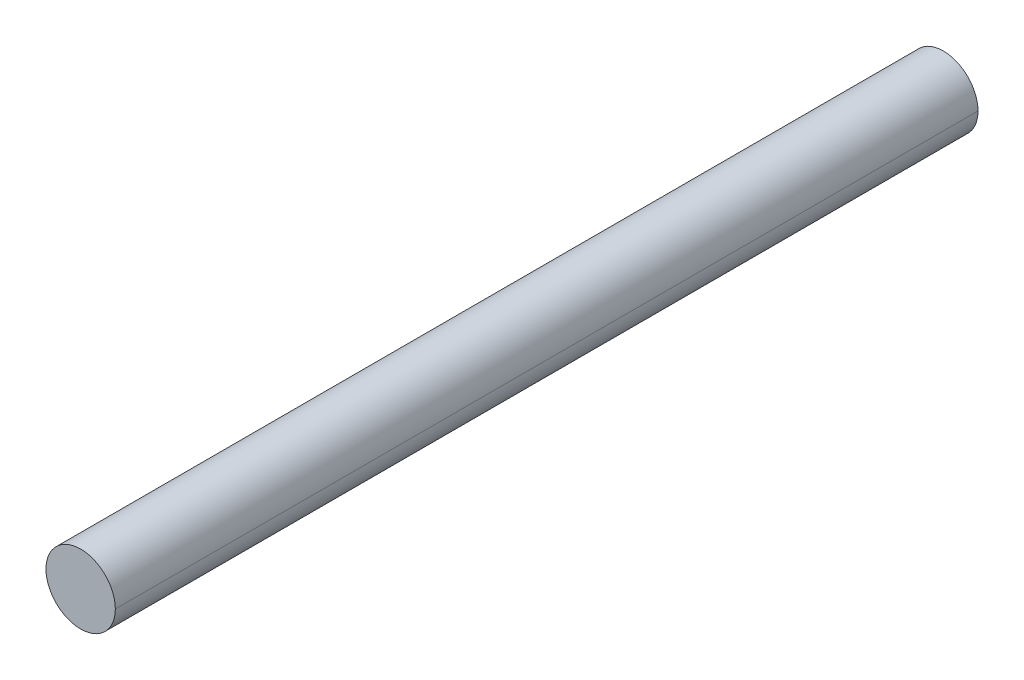
ISO-10303-21;
HEADER;
FILE_DESCRIPTION(('STEP AP214'),'2;1');
FILE_NAME('part.step','',(''),(''),'','','');
FILE_SCHEMA(('AUTOMOTIVE_DESIGN { 1 0 10303 214 1 1 1 1 }'));
ENDSEC;
DATA;
#1=APPLICATION_CONTEXT('core data for automotive mechanical design processes');
#2=APPLICATION_PROTOCOL_DEFINITION('international standard','automotive_design',2000,#1);
#3=PRODUCT_CONTEXT('',#1,'mechanical');
#4=PRODUCT('Part','Part','',(#3));
#5=PRODUCT_RELATED_PRODUCT_CATEGORY('part','',(#4));
#6=PRODUCT_DEFINITION_FORMATION('','',#4);
#7=PRODUCT_DEFINITION_CONTEXT('part definition',#1,'design');
#8=PRODUCT_DEFINITION('design','',#6,#7);
#9=PRODUCT_DEFINITION_SHAPE('','',#8);
#10=(LENGTH_UNIT() NAMED_UNIT(*) SI_UNIT(.MILLI.,.METRE.));
#11=(NAMED_UNIT(*) PLANE_ANGLE_UNIT() SI_UNIT($,.RADIAN.));
#12=(NAMED_UNIT(*) SI_UNIT($,.STERADIAN.) SOLID_ANGLE_UNIT());
#13=UNCERTAINTY_MEASURE_WITH_UNIT(LENGTH_MEASURE(1.E-05),#10,'distance_accuracy_value','');
#14=(GEOMETRIC_REPRESENTATION_CONTEXT(3) GLOBAL_UNCERTAINTY_ASSIGNED_CONTEXT((#13)) GLOBAL_UNIT_ASSIGNED_CONTEXT((#10,
#11,#12)) REPRESENTATION_CONTEXT('',''));
#15=CARTESIAN_POINT('',(0.,0.,0.));
#16=DIRECTION('',(0.,0.,1.));
#17=DIRECTION('',(1.,0.,0.));
#18=AXIS2_PLACEMENT_3D('',#15,#16,#17);
#19=CARTESIAN_POINT('',(24.3,5.71,-35.66));
#20=DIRECTION('',(0.,0.,-1.));
#21=DIRECTION('',(0.,-1.,0.));
#22=AXIS2_PLACEMENT_3D('',#19,#20,#21);
#23=PLANE('',#22);
#24=CARTESIAN_POINT('',(24.3,5.71,-35.66));
#25=DIRECTION('',(0.,0.,-1.));
#26=DIRECTION('',(1.,0.,0.));
#27=AXIS2_PLACEMENT_3D('',#24,#25,#26);
#28=CIRCLE('',#27,0.955);
#29=CARTESIAN_POINT('',(25.255,5.71,-35.66));
#30=VERTEX_POINT('',#29);
#31=CARTESIAN_POINT('',(23.345,5.71,-35.66));
#32=VERTEX_POINT('',#31);
#33=EDGE_CURVE('E61',#30,#32,#28,.T.);
#34=ORIENTED_EDGE('',*,*,#33,.T.);
#35=CARTESIAN_POINT('',(24.3,5.71,-35.66));
#36=DIRECTION('',(0.,0.,-1.));
#37=DIRECTION('',(1.,0.,0.));
#38=AXIS2_PLACEMENT_3D('',#35,#36,#37);
#39=CIRCLE('',#38,0.955);
#40=EDGE_CURVE('E25',#32,#30,#39,.T.);
#41=ORIENTED_EDGE('',*,*,#40,.T.);
#42=EDGE_LOOP('',(#34,#41));
#43=FACE_BOUND('',#42,.T.);
#44=ADVANCED_FACE('F17',(#43),#23,.T.);
#45=CARTESIAN_POINT('',(24.3,5.71,-11.89));
#46=DIRECTION('',(0.,0.,1.));
#47=DIRECTION('',(1.,0.,0.));
#48=AXIS2_PLACEMENT_3D('',#45,#46,#47);
#49=PLANE('',#48);
#50=CARTESIAN_POINT('',(24.3,5.71,-11.89));
#51=DIRECTION('',(0.,0.,1.));
#52=DIRECTION('',(1.,0.,0.));
#53=AXIS2_PLACEMENT_3D('',#50,#51,#52);
#54=CIRCLE('',#53,0.955);
#55=CARTESIAN_POINT('',(25.255,5.71,-11.89));
#56=VERTEX_POINT('',#55);
#57=CARTESIAN_POINT('',(23.345,5.71,-11.89));
#58=VERTEX_POINT('',#57);
#59=EDGE_CURVE('E11',#56,#58,#54,.T.);
#60=ORIENTED_EDGE('',*,*,#59,.T.);
#61=CARTESIAN_POINT('',(24.3,5.71,-11.89));
#62=DIRECTION('',(0.,0.,1.));
#63=DIRECTION('',(1.,0.,0.));
#64=AXIS2_PLACEMENT_3D('',#61,#62,#63);
#65=CIRCLE('',#64,0.955);
#66=EDGE_CURVE('E54',#58,#56,#65,.T.);
#67=ORIENTED_EDGE('',*,*,#66,.T.);
#68=EDGE_LOOP('',(#60,#67));
#69=FACE_BOUND('',#68,.T.);
#70=ADVANCED_FACE('F55',(#69),#49,.T.);
#71=CARTESIAN_POINT('',(24.3,5.71,-23.775));
#72=DIRECTION('',(0.,0.,-1.));
#73=DIRECTION('',(1.,0.,0.));
#74=AXIS2_PLACEMENT_3D('',#71,#72,#73);
#75=CYLINDRICAL_SURFACE('',#74,0.955);
#76=DIRECTION('',(0.,0.,-1.));
#77=VECTOR('',#76,1.);
#78=CARTESIAN_POINT('',(25.255,5.71,-23.775));
#79=LINE('',#78,#77);
#80=EDGE_CURVE('E50',#56,#30,#79,.T.);
#81=ORIENTED_EDGE('',*,*,#80,.T.);
#82=ORIENTED_EDGE('',*,*,#40,.F.);
#83=DIRECTION('',(0.,0.,1.));
#84=VECTOR('',#83,1.);
#85=CARTESIAN_POINT('',(23.345,5.71,-23.775));
#86=LINE('',#85,#84);
#87=EDGE_CURVE('E52',#32,#58,#86,.T.);
#88=ORIENTED_EDGE('',*,*,#87,.T.);
#89=ORIENTED_EDGE('',*,*,#59,.F.);
#90=EDGE_LOOP('',(#81,#82,#88,#89));
#91=FACE_BOUND('',#90,.T.);
#92=ADVANCED_FACE('F48',(#91),#75,.T.);
#93=CARTESIAN_POINT('',(24.3,5.71,-23.775));
#94=DIRECTION('',(0.,0.,-1.));
#95=DIRECTION('',(1.,0.,0.));
#96=AXIS2_PLACEMENT_3D('',#93,#94,#95);
#97=CYLINDRICAL_SURFACE('',#96,0.955);
#98=ORIENTED_EDGE('',*,*,#80,.F.);
#99=ORIENTED_EDGE('',*,*,#66,.F.);
#100=ORIENTED_EDGE('',*,*,#87,.F.);
#101=ORIENTED_EDGE('',*,*,#33,.F.);
#102=EDGE_LOOP('',(#98,#99,#100,#101));
#103=FACE_BOUND('',#102,.T.);
#104=ADVANCED_FACE('F60',(#103),#97,.T.);
#105=CLOSED_SHELL('',(#44,#70,#92,#104));
#106=MANIFOLD_SOLID_BREP('B1',#105);
#107=ADVANCED_BREP_SHAPE_REPRESENTATION('',(#18,#106),#14);
#108=SHAPE_DEFINITION_REPRESENTATION(#9,#107);
ENDSEC;
END-ISO-10303-21;
